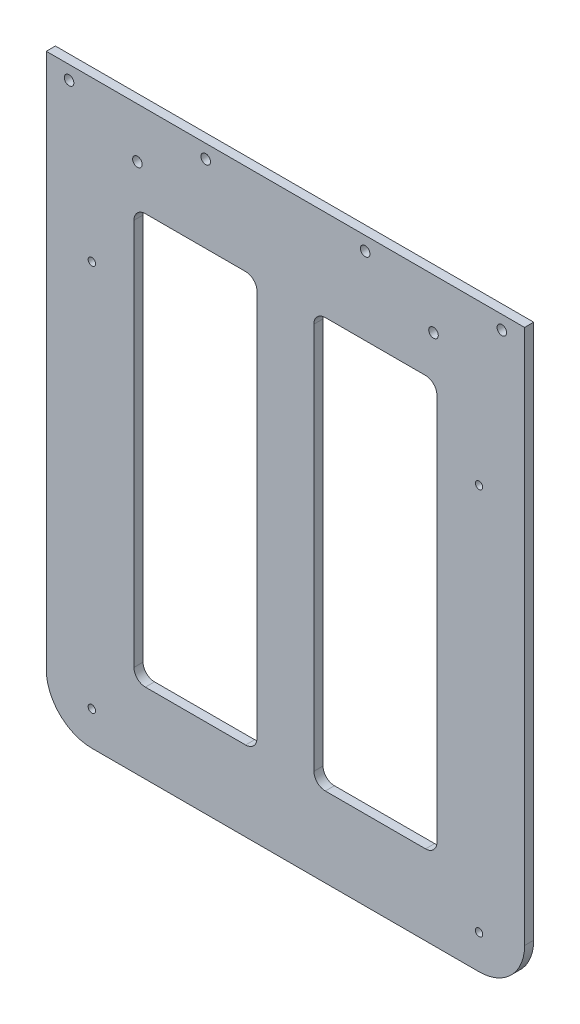
ISO-10303-21;
HEADER;
FILE_DESCRIPTION(('STEP AP214'),'2;1');
FILE_NAME('part.step','',(''),(''),'','','');
FILE_SCHEMA(('AUTOMOTIVE_DESIGN { 1 0 10303 214 1 1 1 1 }'));
ENDSEC;
DATA;
#1=APPLICATION_CONTEXT('core data for automotive mechanical design processes');
#2=APPLICATION_PROTOCOL_DEFINITION('international standard','automotive_design',2000,#1);
#3=PRODUCT_CONTEXT('',#1,'mechanical');
#4=PRODUCT('Part','Part','',(#3));
#5=PRODUCT_RELATED_PRODUCT_CATEGORY('part','',(#4));
#6=PRODUCT_DEFINITION_FORMATION('','',#4);
#7=PRODUCT_DEFINITION_CONTEXT('part definition',#1,'design');
#8=PRODUCT_DEFINITION('design','',#6,#7);
#9=PRODUCT_DEFINITION_SHAPE('','',#8);
#10=(LENGTH_UNIT() NAMED_UNIT(*) SI_UNIT(.MILLI.,.METRE.));
#11=(NAMED_UNIT(*) PLANE_ANGLE_UNIT() SI_UNIT($,.RADIAN.));
#12=(NAMED_UNIT(*) SI_UNIT($,.STERADIAN.) SOLID_ANGLE_UNIT());
#13=UNCERTAINTY_MEASURE_WITH_UNIT(LENGTH_MEASURE(1.E-05),#10,'distance_accuracy_value','');
#14=(GEOMETRIC_REPRESENTATION_CONTEXT(3) GLOBAL_UNCERTAINTY_ASSIGNED_CONTEXT((#13)) GLOBAL_UNIT_ASSIGNED_CONTEXT((#10,
#11,#12)) REPRESENTATION_CONTEXT('',''));
#15=CARTESIAN_POINT('',(0.,0.,0.));
#16=DIRECTION('',(0.,0.,1.));
#17=DIRECTION('',(1.,0.,0.));
#18=AXIS2_PLACEMENT_3D('',#15,#16,#17);
#19=CARTESIAN_POINT('',(0.,0.,0.));
#20=DIRECTION('',(0.,0.,1.));
#21=DIRECTION('',(1.,0.,0.));
#22=AXIS2_PLACEMENT_3D('',#19,#20,#21);
#23=PLANE('',#22);
#24=CARTESIAN_POINT('',(17.5,-87.5,0.));
#25=DIRECTION('',(0.,0.,-1.));
#26=DIRECTION('',(-1.,0.,0.));
#27=AXIS2_PLACEMENT_3D('',#24,#25,#26);
#28=CIRCLE('',#27,5.);
#29=CARTESIAN_POINT('',(12.5,-87.5,0.));
#30=VERTEX_POINT('',#29);
#31=CARTESIAN_POINT('',(17.5,-92.5,0.));
#32=VERTEX_POINT('',#31);
#33=EDGE_CURVE('E292',#30,#32,#28,.F.);
#34=ORIENTED_EDGE('',*,*,#33,.T.);
#35=DIRECTION('',(1.,0.,0.));
#36=VECTOR('',#35,1.);
#37=CARTESIAN_POINT('',(66.5,-92.5,0.));
#38=LINE('',#37,#36);
#39=CARTESIAN_POINT('',(61.5,-92.5,0.));
#40=VERTEX_POINT('',#39);
#41=EDGE_CURVE('E387',#32,#40,#38,.T.);
#42=ORIENTED_EDGE('',*,*,#41,.T.);
#43=CARTESIAN_POINT('',(61.5,-87.5,0.));
#44=DIRECTION('',(0.,0.,-1.));
#45=DIRECTION('',(-1.,0.,0.));
#46=AXIS2_PLACEMENT_3D('',#43,#44,#45);
#47=CIRCLE('',#46,5.);
#48=CARTESIAN_POINT('',(66.5,-87.5,0.));
#49=VERTEX_POINT('',#48);
#50=EDGE_CURVE('E295',#40,#49,#47,.F.);
#51=ORIENTED_EDGE('',*,*,#50,.T.);
#52=DIRECTION('',(0.,1.,0.));
#53=VECTOR('',#52,1.);
#54=CARTESIAN_POINT('',(66.5,87.5,0.));
#55=LINE('',#54,#53);
#56=CARTESIAN_POINT('',(66.5,82.5,0.));
#57=VERTEX_POINT('',#56);
#58=EDGE_CURVE('E391',#49,#57,#55,.T.);
#59=ORIENTED_EDGE('',*,*,#58,.T.);
#60=CARTESIAN_POINT('',(61.5,82.5,0.));
#61=DIRECTION('',(0.,0.,-1.));
#62=DIRECTION('',(-1.,0.,0.));
#63=AXIS2_PLACEMENT_3D('',#60,#61,#62);
#64=CIRCLE('',#63,5.);
#65=CARTESIAN_POINT('',(61.5,87.5,0.));
#66=VERTEX_POINT('',#65);
#67=EDGE_CURVE('E299',#57,#66,#64,.F.);
#68=ORIENTED_EDGE('',*,*,#67,.T.);
#69=DIRECTION('',(1.,0.,0.));
#70=VECTOR('',#69,1.);
#71=CARTESIAN_POINT('',(12.5,87.5,0.));
#72=LINE('',#71,#70);
#73=CARTESIAN_POINT('',(17.5,87.5,0.));
#74=VERTEX_POINT('',#73);
#75=EDGE_CURVE('E393',#66,#74,#72,.F.);
#76=ORIENTED_EDGE('',*,*,#75,.T.);
#77=CARTESIAN_POINT('',(17.5,82.5,0.));
#78=DIRECTION('',(0.,0.,-1.));
#79=DIRECTION('',(-1.,0.,0.));
#80=AXIS2_PLACEMENT_3D('',#77,#78,#79);
#81=CIRCLE('',#80,5.);
#82=CARTESIAN_POINT('',(12.5,82.5,0.));
#83=VERTEX_POINT('',#82);
#84=EDGE_CURVE('E303',#74,#83,#81,.F.);
#85=ORIENTED_EDGE('',*,*,#84,.T.);
#86=DIRECTION('',(0.,-1.,0.));
#87=VECTOR('',#86,1.);
#88=CARTESIAN_POINT('',(12.5,-92.5,0.));
#89=LINE('',#88,#87);
#90=EDGE_CURVE('E306',#83,#30,#89,.T.);
#91=ORIENTED_EDGE('',*,*,#90,.T.);
#92=EDGE_LOOP('',(#34,#42,#51,#59,#68,#76,#85,#91));
#93=FACE_BOUND('',#92,.T.);
#94=CARTESIAN_POINT('',(-61.5,-87.5,0.));
#95=DIRECTION('',(0.,0.,-1.));
#96=DIRECTION('',(-1.,0.,0.));
#97=AXIS2_PLACEMENT_3D('',#94,#95,#96);
#98=CIRCLE('',#97,5.);
#99=CARTESIAN_POINT('',(-66.5,-87.5,0.));
#100=VERTEX_POINT('',#99);
#101=CARTESIAN_POINT('',(-61.5,-92.5,0.));
#102=VERTEX_POINT('',#101);
#103=EDGE_CURVE('E307',#100,#102,#98,.F.);
#104=ORIENTED_EDGE('',*,*,#103,.T.);
#105=DIRECTION('',(1.,0.,0.));
#106=VECTOR('',#105,1.);
#107=CARTESIAN_POINT('',(-12.5,-92.5,0.));
#108=LINE('',#107,#106);
#109=CARTESIAN_POINT('',(-17.5,-92.5,0.));
#110=VERTEX_POINT('',#109);
#111=EDGE_CURVE('E395',#102,#110,#108,.T.);
#112=ORIENTED_EDGE('',*,*,#111,.T.);
#113=CARTESIAN_POINT('',(-17.5,-87.5,0.));
#114=DIRECTION('',(0.,0.,-1.));
#115=DIRECTION('',(-1.,0.,0.));
#116=AXIS2_PLACEMENT_3D('',#113,#114,#115);
#117=CIRCLE('',#116,5.);
#118=CARTESIAN_POINT('',(-12.5,-87.5,0.));
#119=VERTEX_POINT('',#118);
#120=EDGE_CURVE('E311',#110,#119,#117,.F.);
#121=ORIENTED_EDGE('',*,*,#120,.T.);
#122=DIRECTION('',(0.,1.,0.));
#123=VECTOR('',#122,1.);
#124=CARTESIAN_POINT('',(-12.5,87.5,0.));
#125=LINE('',#124,#123);
#126=CARTESIAN_POINT('',(-12.5,82.5,0.));
#127=VERTEX_POINT('',#126);
#128=EDGE_CURVE('E398',#119,#127,#125,.T.);
#129=ORIENTED_EDGE('',*,*,#128,.T.);
#130=CARTESIAN_POINT('',(-17.5,82.5,0.));
#131=DIRECTION('',(0.,0.,-1.));
#132=DIRECTION('',(-1.,0.,0.));
#133=AXIS2_PLACEMENT_3D('',#130,#131,#132);
#134=CIRCLE('',#133,5.);
#135=CARTESIAN_POINT('',(-17.5,87.5,0.));
#136=VERTEX_POINT('',#135);
#137=EDGE_CURVE('E315',#127,#136,#134,.F.);
#138=ORIENTED_EDGE('',*,*,#137,.T.);
#139=DIRECTION('',(1.,0.,0.));
#140=VECTOR('',#139,1.);
#141=CARTESIAN_POINT('',(-66.5,87.5,0.));
#142=LINE('',#141,#140);
#143=CARTESIAN_POINT('',(-61.5,87.5,0.));
#144=VERTEX_POINT('',#143);
#145=EDGE_CURVE('E190',#136,#144,#142,.F.);
#146=ORIENTED_EDGE('',*,*,#145,.T.);
#147=CARTESIAN_POINT('',(-61.5,82.5,0.));
#148=DIRECTION('',(0.,0.,-1.));
#149=DIRECTION('',(-1.,0.,0.));
#150=AXIS2_PLACEMENT_3D('',#147,#148,#149);
#151=CIRCLE('',#150,5.);
#152=CARTESIAN_POINT('',(-66.5,82.5,0.));
#153=VERTEX_POINT('',#152);
#154=EDGE_CURVE('E319',#144,#153,#151,.F.);
#155=ORIENTED_EDGE('',*,*,#154,.T.);
#156=DIRECTION('',(0.,-1.,0.));
#157=VECTOR('',#156,1.);
#158=CARTESIAN_POINT('',(-66.5,-92.5,0.));
#159=LINE('',#158,#157);
#160=EDGE_CURVE('E322',#153,#100,#159,.T.);
#161=ORIENTED_EDGE('',*,*,#160,.T.);
#162=EDGE_LOOP('',(#104,#112,#121,#129,#138,#146,#155,#161));
#163=FACE_BOUND('',#162,.T.);
#164=CARTESIAN_POINT('',(95.,121.5,0.));
#165=DIRECTION('',(0.,0.,1.));
#166=DIRECTION('',(1.,0.,0.));
#167=AXIS2_PLACEMENT_3D('',#164,#165,#166);
#168=CIRCLE('',#167,2.1);
#169=CARTESIAN_POINT('',(97.1,121.5,0.));
#170=VERTEX_POINT('',#169);
#171=EDGE_CURVE('E323',#170,#170,#168,.T.);
#172=ORIENTED_EDGE('',*,*,#171,.T.);
#173=EDGE_LOOP('',(#172));
#174=FACE_BOUND('',#173,.T.);
#175=CARTESIAN_POINT('',(35.,121.5,0.));
#176=DIRECTION('',(0.,0.,1.));
#177=DIRECTION('',(1.,0.,0.));
#178=AXIS2_PLACEMENT_3D('',#175,#176,#177);
#179=CIRCLE('',#178,2.1);
#180=CARTESIAN_POINT('',(37.1,121.5,0.));
#181=VERTEX_POINT('',#180);
#182=EDGE_CURVE('E326',#181,#181,#179,.T.);
#183=ORIENTED_EDGE('',*,*,#182,.T.);
#184=EDGE_LOOP('',(#183));
#185=FACE_BOUND('',#184,.T.);
#186=CARTESIAN_POINT('',(-95.,121.5,0.));
#187=DIRECTION('',(0.,0.,1.));
#188=DIRECTION('',(1.,0.,0.));
#189=AXIS2_PLACEMENT_3D('',#186,#187,#188);
#190=CIRCLE('',#189,2.1);
#191=CARTESIAN_POINT('',(-92.9,121.5,0.));
#192=VERTEX_POINT('',#191);
#193=EDGE_CURVE('E331',#192,#192,#190,.T.);
#194=ORIENTED_EDGE('',*,*,#193,.T.);
#195=EDGE_LOOP('',(#194));
#196=FACE_BOUND('',#195,.T.);
#197=CARTESIAN_POINT('',(-65.,105.5,0.));
#198=DIRECTION('',(0.,0.,1.));
#199=DIRECTION('',(1.,0.,0.));
#200=AXIS2_PLACEMENT_3D('',#197,#198,#199);
#201=CIRCLE('',#200,2.1);
#202=CARTESIAN_POINT('',(-62.9,105.5,0.));
#203=VERTEX_POINT('',#202);
#204=EDGE_CURVE('E336',#203,#203,#201,.T.);
#205=ORIENTED_EDGE('',*,*,#204,.T.);
#206=EDGE_LOOP('',(#205));
#207=FACE_BOUND('',#206,.T.);
#208=CARTESIAN_POINT('',(-35.,121.5,0.));
#209=DIRECTION('',(0.,0.,1.));
#210=DIRECTION('',(1.,0.,0.));
#211=AXIS2_PLACEMENT_3D('',#208,#209,#210);
#212=CIRCLE('',#211,2.1);
#213=CARTESIAN_POINT('',(-32.9,121.5,0.));
#214=VERTEX_POINT('',#213);
#215=EDGE_CURVE('E341',#214,#214,#212,.T.);
#216=ORIENTED_EDGE('',*,*,#215,.T.);
#217=EDGE_LOOP('',(#216));
#218=FACE_BOUND('',#217,.T.);
#219=CARTESIAN_POINT('',(65.,105.5,0.));
#220=DIRECTION('',(0.,0.,1.));
#221=DIRECTION('',(1.,0.,0.));
#222=AXIS2_PLACEMENT_3D('',#219,#220,#221);
#223=CIRCLE('',#222,2.1);
#224=CARTESIAN_POINT('',(67.1,105.5,0.));
#225=VERTEX_POINT('',#224);
#226=EDGE_CURVE('E346',#225,#225,#223,.T.);
#227=ORIENTED_EDGE('',*,*,#226,.T.);
#228=EDGE_LOOP('',(#227));
#229=FACE_BOUND('',#228,.T.);
#230=CARTESIAN_POINT('',(85.,-112.5,0.));
#231=DIRECTION('',(0.,0.,1.));
#232=DIRECTION('',(1.,0.,0.));
#233=AXIS2_PLACEMENT_3D('',#230,#231,#232);
#234=CIRCLE('',#233,1.621);
#235=CARTESIAN_POINT('',(86.621,-112.5,0.));
#236=VERTEX_POINT('',#235);
#237=EDGE_CURVE('E351',#236,#236,#234,.T.);
#238=ORIENTED_EDGE('',*,*,#237,.T.);
#239=EDGE_LOOP('',(#238));
#240=FACE_BOUND('',#239,.T.);
#241=CARTESIAN_POINT('',(-85.,57.5,0.));
#242=DIRECTION('',(0.,0.,1.));
#243=DIRECTION('',(1.,0.,0.));
#244=AXIS2_PLACEMENT_3D('',#241,#242,#243);
#245=CIRCLE('',#244,1.621);
#246=CARTESIAN_POINT('',(-83.379,57.5,0.));
#247=VERTEX_POINT('',#246);
#248=EDGE_CURVE('E356',#247,#247,#245,.T.);
#249=ORIENTED_EDGE('',*,*,#248,.T.);
#250=EDGE_LOOP('',(#249));
#251=FACE_BOUND('',#250,.T.);
#252=CARTESIAN_POINT('',(-85.,-112.5,0.));
#253=DIRECTION('',(0.,0.,1.));
#254=DIRECTION('',(1.,0.,0.));
#255=AXIS2_PLACEMENT_3D('',#252,#253,#254);
#256=CIRCLE('',#255,1.621);
#257=CARTESIAN_POINT('',(-83.379,-112.5,0.));
#258=VERTEX_POINT('',#257);
#259=EDGE_CURVE('E185',#258,#258,#256,.T.);
#260=ORIENTED_EDGE('',*,*,#259,.T.);
#261=EDGE_LOOP('',(#260));
#262=FACE_BOUND('',#261,.T.);
#263=CARTESIAN_POINT('',(85.,57.5,0.));
#264=DIRECTION('',(0.,0.,1.));
#265=DIRECTION('',(1.,0.,0.));
#266=AXIS2_PLACEMENT_3D('',#263,#264,#265);
#267=CIRCLE('',#266,1.621);
#268=CARTESIAN_POINT('',(86.621,57.5,0.));
#269=VERTEX_POINT('',#268);
#270=EDGE_CURVE('E182',#269,#269,#267,.T.);
#271=ORIENTED_EDGE('',*,*,#270,.T.);
#272=EDGE_LOOP('',(#271));
#273=FACE_BOUND('',#272,.T.);
#274=DIRECTION('',(1.,0.,0.));
#275=VECTOR('',#274,1.);
#276=CARTESIAN_POINT('',(-105.,-127.5,0.));
#277=LINE('',#276,#275);
#278=CARTESIAN_POINT('',(-85.,-127.5,0.));
#279=VERTEX_POINT('',#278);
#280=CARTESIAN_POINT('',(85.,-127.5,0.));
#281=VERTEX_POINT('',#280);
#282=EDGE_CURVE('E162',#279,#281,#277,.T.);
#283=ORIENTED_EDGE('',*,*,#282,.F.);
#284=CARTESIAN_POINT('',(-85.,-107.5,0.));
#285=DIRECTION('',(0.,0.,1.));
#286=DIRECTION('',(1.,0.,0.));
#287=AXIS2_PLACEMENT_3D('',#284,#285,#286);
#288=CIRCLE('',#287,20.);
#289=CARTESIAN_POINT('',(-105.,-107.5,0.));
#290=VERTEX_POINT('',#289);
#291=EDGE_CURVE('E179',#290,#279,#288,.T.);
#292=ORIENTED_EDGE('',*,*,#291,.F.);
#293=DIRECTION('',(0.,1.,0.));
#294=VECTOR('',#293,1.);
#295=CARTESIAN_POINT('',(-105.,127.5,0.));
#296=LINE('',#295,#294);
#297=CARTESIAN_POINT('',(-105.,127.5,0.));
#298=VERTEX_POINT('',#297);
#299=EDGE_CURVE('E192',#298,#290,#296,.F.);
#300=ORIENTED_EDGE('',*,*,#299,.F.);
#301=DIRECTION('',(1.,0.,0.));
#302=VECTOR('',#301,1.);
#303=CARTESIAN_POINT('',(105.,127.5,0.));
#304=LINE('',#303,#302);
#305=CARTESIAN_POINT('',(105.,127.5,0.));
#306=VERTEX_POINT('',#305);
#307=EDGE_CURVE('E198',#306,#298,#304,.F.);
#308=ORIENTED_EDGE('',*,*,#307,.F.);
#309=DIRECTION('',(0.,1.,0.));
#310=VECTOR('',#309,1.);
#311=CARTESIAN_POINT('',(105.,-127.5,0.));
#312=LINE('',#311,#310);
#313=CARTESIAN_POINT('',(105.,-107.5,0.));
#314=VERTEX_POINT('',#313);
#315=EDGE_CURVE('E166',#314,#306,#312,.T.);
#316=ORIENTED_EDGE('',*,*,#315,.F.);
#317=CARTESIAN_POINT('',(85.,-107.5,0.));
#318=DIRECTION('',(0.,0.,1.));
#319=DIRECTION('',(1.,0.,0.));
#320=AXIS2_PLACEMENT_3D('',#317,#318,#319);
#321=CIRCLE('',#320,20.);
#322=EDGE_CURVE('E20',#281,#314,#321,.T.);
#323=ORIENTED_EDGE('',*,*,#322,.F.);
#324=EDGE_LOOP('',(#283,#292,#300,#308,#316,#323));
#325=FACE_BOUND('',#324,.T.);
#326=ADVANCED_FACE('F17',(#93,#163,#174,#185,#196,#207,#218,#229,#240,#251,#262,#273,#325),#23,.F.);
#327=CARTESIAN_POINT('',(85.,-107.5,0.));
#328=DIRECTION('',(0.,0.,1.));
#329=DIRECTION('',(1.,0.,0.));
#330=AXIS2_PLACEMENT_3D('',#327,#328,#329);
#331=CYLINDRICAL_SURFACE('',#330,20.);
#332=ORIENTED_EDGE('',*,*,#322,.T.);
#333=DIRECTION('',(0.,0.,-1.));
#334=VECTOR('',#333,1.);
#335=CARTESIAN_POINT('',(105.,-107.5,0.));
#336=LINE('',#335,#334);
#337=CARTESIAN_POINT('',(105.,-107.5,4.));
#338=VERTEX_POINT('',#337);
#339=EDGE_CURVE('E169',#338,#314,#336,.T.);
#340=ORIENTED_EDGE('',*,*,#339,.F.);
#341=CARTESIAN_POINT('',(85.,-107.5,4.));
#342=DIRECTION('',(0.,0.,1.));
#343=DIRECTION('',(1.,0.,0.));
#344=AXIS2_PLACEMENT_3D('',#341,#342,#343);
#345=CIRCLE('',#344,20.);
#346=CARTESIAN_POINT('',(85.,-127.5,4.));
#347=VERTEX_POINT('',#346);
#348=EDGE_CURVE('E174',#347,#338,#345,.T.);
#349=ORIENTED_EDGE('',*,*,#348,.F.);
#350=DIRECTION('',(0.,0.,-1.));
#351=VECTOR('',#350,1.);
#352=CARTESIAN_POINT('',(85.,-127.5,0.));
#353=LINE('',#352,#351);
#354=EDGE_CURVE('E171',#281,#347,#353,.F.);
#355=ORIENTED_EDGE('',*,*,#354,.F.);
#356=EDGE_LOOP('',(#332,#340,#349,#355));
#357=FACE_BOUND('',#356,.T.);
#358=ADVANCED_FACE('F172',(#357),#331,.T.);
#359=CARTESIAN_POINT('',(105.,-127.5,0.));
#360=DIRECTION('',(1.,0.,0.));
#361=DIRECTION('',(0.,0.,-1.));
#362=AXIS2_PLACEMENT_3D('',#359,#360,#361);
#363=PLANE('',#362);
#364=DIRECTION('',(0.,0.,1.));
#365=VECTOR('',#364,1.);
#366=CARTESIAN_POINT('',(105.,127.5,0.));
#367=LINE('',#366,#365);
#368=CARTESIAN_POINT('',(105.,127.5,4.));
#369=VERTEX_POINT('',#368);
#370=EDGE_CURVE('E201',#369,#306,#367,.F.);
#371=ORIENTED_EDGE('',*,*,#370,.F.);
#372=DIRECTION('',(0.,1.,0.));
#373=VECTOR('',#372,1.);
#374=CARTESIAN_POINT('',(105.,0.,4.));
#375=LINE('',#374,#373);
#376=EDGE_CURVE('E291',#338,#369,#375,.T.);
#377=ORIENTED_EDGE('',*,*,#376,.F.);
#378=ORIENTED_EDGE('',*,*,#339,.T.);
#379=ORIENTED_EDGE('',*,*,#315,.T.);
#380=EDGE_LOOP('',(#371,#377,#378,#379));
#381=FACE_BOUND('',#380,.T.);
#382=ADVANCED_FACE('F609',(#381),#363,.T.);
#383=CARTESIAN_POINT('',(105.,127.5,0.));
#384=DIRECTION('',(0.,1.,0.));
#385=DIRECTION('',(0.,0.,1.));
#386=AXIS2_PLACEMENT_3D('',#383,#384,#385);
#387=PLANE('',#386);
#388=DIRECTION('',(1.,0.,0.));
#389=VECTOR('',#388,1.);
#390=CARTESIAN_POINT('',(0.,127.5,4.));
#391=LINE('',#390,#389);
#392=CARTESIAN_POINT('',(-105.,127.5,4.));
#393=VERTEX_POINT('',#392);
#394=EDGE_CURVE('E377',#369,#393,#391,.F.);
#395=ORIENTED_EDGE('',*,*,#394,.F.);
#396=ORIENTED_EDGE('',*,*,#370,.T.);
#397=ORIENTED_EDGE('',*,*,#307,.T.);
#398=DIRECTION('',(0.,0.,1.));
#399=VECTOR('',#398,1.);
#400=CARTESIAN_POINT('',(-105.,127.5,0.));
#401=LINE('',#400,#399);
#402=EDGE_CURVE('E195',#393,#298,#401,.F.);
#403=ORIENTED_EDGE('',*,*,#402,.F.);
#404=EDGE_LOOP('',(#395,#396,#397,#403));
#405=FACE_BOUND('',#404,.T.);
#406=ADVANCED_FACE('F605',(#405),#387,.T.);
#407=CARTESIAN_POINT('',(-105.,127.5,0.));
#408=DIRECTION('',(-1.,0.,0.));
#409=DIRECTION('',(0.,0.,1.));
#410=AXIS2_PLACEMENT_3D('',#407,#408,#409);
#411=PLANE('',#410);
#412=ORIENTED_EDGE('',*,*,#402,.T.);
#413=ORIENTED_EDGE('',*,*,#299,.T.);
#414=DIRECTION('',(0.,0.,1.));
#415=VECTOR('',#414,1.);
#416=CARTESIAN_POINT('',(-105.,-107.5,0.));
#417=LINE('',#416,#415);
#418=CARTESIAN_POINT('',(-105.,-107.5,4.));
#419=VERTEX_POINT('',#418);
#420=EDGE_CURVE('E194',#419,#290,#417,.F.);
#421=ORIENTED_EDGE('',*,*,#420,.F.);
#422=DIRECTION('',(0.,1.,0.));
#423=VECTOR('',#422,1.);
#424=CARTESIAN_POINT('',(-105.,0.,4.));
#425=LINE('',#424,#423);
#426=EDGE_CURVE('E289',#393,#419,#425,.F.);
#427=ORIENTED_EDGE('',*,*,#426,.F.);
#428=EDGE_LOOP('',(#412,#413,#421,#427));
#429=FACE_BOUND('',#428,.T.);
#430=ADVANCED_FACE('F602',(#429),#411,.T.);
#431=CARTESIAN_POINT('',(-85.,-107.5,0.));
#432=DIRECTION('',(0.,0.,1.));
#433=DIRECTION('',(1.,0.,0.));
#434=AXIS2_PLACEMENT_3D('',#431,#432,#433);
#435=CYLINDRICAL_SURFACE('',#434,20.);
#436=ORIENTED_EDGE('',*,*,#291,.T.);
#437=DIRECTION('',(0.,0.,-1.));
#438=VECTOR('',#437,1.);
#439=CARTESIAN_POINT('',(-85.,-127.5,0.));
#440=LINE('',#439,#438);
#441=CARTESIAN_POINT('',(-85.,-127.5,4.));
#442=VERTEX_POINT('',#441);
#443=EDGE_CURVE('E178',#442,#279,#440,.T.);
#444=ORIENTED_EDGE('',*,*,#443,.F.);
#445=CARTESIAN_POINT('',(-85.,-107.5,4.));
#446=DIRECTION('',(0.,0.,1.));
#447=DIRECTION('',(1.,0.,0.));
#448=AXIS2_PLACEMENT_3D('',#445,#446,#447);
#449=CIRCLE('',#448,20.);
#450=EDGE_CURVE('E286',#419,#442,#449,.T.);
#451=ORIENTED_EDGE('',*,*,#450,.F.);
#452=ORIENTED_EDGE('',*,*,#420,.T.);
#453=EDGE_LOOP('',(#436,#444,#451,#452));
#454=FACE_BOUND('',#453,.T.);
#455=ADVANCED_FACE('F599',(#454),#435,.T.);
#456=CARTESIAN_POINT('',(-105.,-127.5,0.));
#457=DIRECTION('',(0.,-1.,0.));
#458=DIRECTION('',(0.,0.,-1.));
#459=AXIS2_PLACEMENT_3D('',#456,#457,#458);
#460=PLANE('',#459);
#461=ORIENTED_EDGE('',*,*,#443,.T.);
#462=ORIENTED_EDGE('',*,*,#282,.T.);
#463=ORIENTED_EDGE('',*,*,#354,.T.);
#464=DIRECTION('',(1.,0.,0.));
#465=VECTOR('',#464,1.);
#466=CARTESIAN_POINT('',(0.,-127.5,4.));
#467=LINE('',#466,#465);
#468=EDGE_CURVE('E283',#442,#347,#467,.T.);
#469=ORIENTED_EDGE('',*,*,#468,.F.);
#470=EDGE_LOOP('',(#461,#462,#463,#469));
#471=FACE_BOUND('',#470,.T.);
#472=ADVANCED_FACE('F181',(#471),#460,.T.);
#473=CARTESIAN_POINT('',(85.,57.5,-1.9));
#474=DIRECTION('',(0.,0.,1.));
#475=DIRECTION('',(1.,0.,0.));
#476=AXIS2_PLACEMENT_3D('',#473,#474,#475);
#477=CYLINDRICAL_SURFACE('',#476,1.621);
#478=CARTESIAN_POINT('',(85.,57.5,4.));
#479=DIRECTION('',(0.,0.,1.));
#480=DIRECTION('',(1.,0.,0.));
#481=AXIS2_PLACEMENT_3D('',#478,#479,#480);
#482=CIRCLE('',#481,1.621);
#483=CARTESIAN_POINT('',(86.621,57.5,4.));
#484=VERTEX_POINT('',#483);
#485=EDGE_CURVE('E278',#484,#484,#482,.F.);
#486=ORIENTED_EDGE('',*,*,#485,.F.);
#487=EDGE_LOOP('',(#486));
#488=FACE_BOUND('',#487,.T.);
#489=ORIENTED_EDGE('',*,*,#270,.F.);
#490=EDGE_LOOP('',(#489));
#491=FACE_BOUND('',#490,.T.);
#492=ADVANCED_FACE('F592',(#488,#491),#477,.F.);
#493=CARTESIAN_POINT('',(-85.,-112.5,-1.9));
#494=DIRECTION('',(0.,0.,1.));
#495=DIRECTION('',(1.,0.,0.));
#496=AXIS2_PLACEMENT_3D('',#493,#494,#495);
#497=CYLINDRICAL_SURFACE('',#496,1.621);
#498=CARTESIAN_POINT('',(-85.,-112.5,4.));
#499=DIRECTION('',(0.,0.,1.));
#500=DIRECTION('',(1.,0.,0.));
#501=AXIS2_PLACEMENT_3D('',#498,#499,#500);
#502=CIRCLE('',#501,1.621);
#503=CARTESIAN_POINT('',(-83.379,-112.5,4.));
#504=VERTEX_POINT('',#503);
#505=EDGE_CURVE('E273',#504,#504,#502,.F.);
#506=ORIENTED_EDGE('',*,*,#505,.F.);
#507=EDGE_LOOP('',(#506));
#508=FACE_BOUND('',#507,.T.);
#509=ORIENTED_EDGE('',*,*,#259,.F.);
#510=EDGE_LOOP('',(#509));
#511=FACE_BOUND('',#510,.T.);
#512=ADVANCED_FACE('F588',(#508,#511),#497,.F.);
#513=CARTESIAN_POINT('',(-85.,57.5,-1.9));
#514=DIRECTION('',(0.,0.,1.));
#515=DIRECTION('',(1.,0.,0.));
#516=AXIS2_PLACEMENT_3D('',#513,#514,#515);
#517=CYLINDRICAL_SURFACE('',#516,1.621);
#518=CARTESIAN_POINT('',(-85.,57.5,4.));
#519=DIRECTION('',(0.,0.,1.));
#520=DIRECTION('',(1.,0.,0.));
#521=AXIS2_PLACEMENT_3D('',#518,#519,#520);
#522=CIRCLE('',#521,1.621);
#523=CARTESIAN_POINT('',(-83.379,57.5,4.));
#524=VERTEX_POINT('',#523);
#525=EDGE_CURVE('E268',#524,#524,#522,.F.);
#526=ORIENTED_EDGE('',*,*,#525,.F.);
#527=EDGE_LOOP('',(#526));
#528=FACE_BOUND('',#527,.T.);
#529=ORIENTED_EDGE('',*,*,#248,.F.);
#530=EDGE_LOOP('',(#529));
#531=FACE_BOUND('',#530,.T.);
#532=ADVANCED_FACE('F584',(#528,#531),#517,.F.);
#533=CARTESIAN_POINT('',(85.,-112.5,-1.9));
#534=DIRECTION('',(0.,0.,1.));
#535=DIRECTION('',(1.,0.,0.));
#536=AXIS2_PLACEMENT_3D('',#533,#534,#535);
#537=CYLINDRICAL_SURFACE('',#536,1.621);
#538=CARTESIAN_POINT('',(85.,-112.5,4.));
#539=DIRECTION('',(0.,0.,1.));
#540=DIRECTION('',(1.,0.,0.));
#541=AXIS2_PLACEMENT_3D('',#538,#539,#540);
#542=CIRCLE('',#541,1.621);
#543=CARTESIAN_POINT('',(86.621,-112.5,4.));
#544=VERTEX_POINT('',#543);
#545=EDGE_CURVE('E263',#544,#544,#542,.F.);
#546=ORIENTED_EDGE('',*,*,#545,.F.);
#547=EDGE_LOOP('',(#546));
#548=FACE_BOUND('',#547,.T.);
#549=ORIENTED_EDGE('',*,*,#237,.F.);
#550=EDGE_LOOP('',(#549));
#551=FACE_BOUND('',#550,.T.);
#552=ADVANCED_FACE('F580',(#548,#551),#537,.F.);
#553=CARTESIAN_POINT('',(65.,105.5,0.));
#554=DIRECTION('',(0.,0.,1.));
#555=DIRECTION('',(1.,0.,0.));
#556=AXIS2_PLACEMENT_3D('',#553,#554,#555);
#557=CYLINDRICAL_SURFACE('',#556,2.1);
#558=CARTESIAN_POINT('',(65.,105.5,4.));
#559=DIRECTION('',(0.,0.,1.));
#560=DIRECTION('',(1.,0.,0.));
#561=AXIS2_PLACEMENT_3D('',#558,#559,#560);
#562=CIRCLE('',#561,2.1);
#563=CARTESIAN_POINT('',(67.1,105.5,4.));
#564=VERTEX_POINT('',#563);
#565=EDGE_CURVE('E258',#564,#564,#562,.F.);
#566=ORIENTED_EDGE('',*,*,#565,.F.);
#567=EDGE_LOOP('',(#566));
#568=FACE_BOUND('',#567,.T.);
#569=ORIENTED_EDGE('',*,*,#226,.F.);
#570=EDGE_LOOP('',(#569));
#571=FACE_BOUND('',#570,.T.);
#572=ADVANCED_FACE('F576',(#568,#571),#557,.F.);
#573=CARTESIAN_POINT('',(-35.,121.5,0.));
#574=DIRECTION('',(0.,0.,1.));
#575=DIRECTION('',(1.,0.,0.));
#576=AXIS2_PLACEMENT_3D('',#573,#574,#575);
#577=CYLINDRICAL_SURFACE('',#576,2.1);
#578=CARTESIAN_POINT('',(-35.,121.5,4.));
#579=DIRECTION('',(0.,0.,1.));
#580=DIRECTION('',(1.,0.,0.));
#581=AXIS2_PLACEMENT_3D('',#578,#579,#580);
#582=CIRCLE('',#581,2.1);
#583=CARTESIAN_POINT('',(-32.9,121.5,4.));
#584=VERTEX_POINT('',#583);
#585=EDGE_CURVE('E253',#584,#584,#582,.F.);
#586=ORIENTED_EDGE('',*,*,#585,.F.);
#587=EDGE_LOOP('',(#586));
#588=FACE_BOUND('',#587,.T.);
#589=ORIENTED_EDGE('',*,*,#215,.F.);
#590=EDGE_LOOP('',(#589));
#591=FACE_BOUND('',#590,.T.);
#592=ADVANCED_FACE('F572',(#588,#591),#577,.F.);
#593=CARTESIAN_POINT('',(-65.,105.5,0.));
#594=DIRECTION('',(0.,0.,1.));
#595=DIRECTION('',(1.,0.,0.));
#596=AXIS2_PLACEMENT_3D('',#593,#594,#595);
#597=CYLINDRICAL_SURFACE('',#596,2.1);
#598=CARTESIAN_POINT('',(-65.,105.5,4.));
#599=DIRECTION('',(0.,0.,1.));
#600=DIRECTION('',(1.,0.,0.));
#601=AXIS2_PLACEMENT_3D('',#598,#599,#600);
#602=CIRCLE('',#601,2.1);
#603=CARTESIAN_POINT('',(-62.9,105.5,4.));
#604=VERTEX_POINT('',#603);
#605=EDGE_CURVE('E248',#604,#604,#602,.F.);
#606=ORIENTED_EDGE('',*,*,#605,.F.);
#607=EDGE_LOOP('',(#606));
#608=FACE_BOUND('',#607,.T.);
#609=ORIENTED_EDGE('',*,*,#204,.F.);
#610=EDGE_LOOP('',(#609));
#611=FACE_BOUND('',#610,.T.);
#612=ADVANCED_FACE('F568',(#608,#611),#597,.F.);
#613=CARTESIAN_POINT('',(-95.,121.5,0.));
#614=DIRECTION('',(0.,0.,1.));
#615=DIRECTION('',(1.,0.,0.));
#616=AXIS2_PLACEMENT_3D('',#613,#614,#615);
#617=CYLINDRICAL_SURFACE('',#616,2.1);
#618=CARTESIAN_POINT('',(-95.,121.5,4.));
#619=DIRECTION('',(0.,0.,1.));
#620=DIRECTION('',(1.,0.,0.));
#621=AXIS2_PLACEMENT_3D('',#618,#619,#620);
#622=CIRCLE('',#621,2.1);
#623=CARTESIAN_POINT('',(-92.9,121.5,4.));
#624=VERTEX_POINT('',#623);
#625=EDGE_CURVE('E243',#624,#624,#622,.F.);
#626=ORIENTED_EDGE('',*,*,#625,.F.);
#627=EDGE_LOOP('',(#626));
#628=FACE_BOUND('',#627,.T.);
#629=ORIENTED_EDGE('',*,*,#193,.F.);
#630=EDGE_LOOP('',(#629));
#631=FACE_BOUND('',#630,.T.);
#632=ADVANCED_FACE('F564',(#628,#631),#617,.F.);
#633=CARTESIAN_POINT('',(35.,121.5,0.));
#634=DIRECTION('',(0.,0.,1.));
#635=DIRECTION('',(1.,0.,0.));
#636=AXIS2_PLACEMENT_3D('',#633,#634,#635);
#637=CYLINDRICAL_SURFACE('',#636,2.1);
#638=CARTESIAN_POINT('',(35.,121.5,4.));
#639=DIRECTION('',(0.,0.,1.));
#640=DIRECTION('',(1.,0.,0.));
#641=AXIS2_PLACEMENT_3D('',#638,#639,#640);
#642=CIRCLE('',#641,2.1);
#643=CARTESIAN_POINT('',(37.1,121.5,4.));
#644=VERTEX_POINT('',#643);
#645=EDGE_CURVE('E238',#644,#644,#642,.F.);
#646=ORIENTED_EDGE('',*,*,#645,.F.);
#647=EDGE_LOOP('',(#646));
#648=FACE_BOUND('',#647,.T.);
#649=ORIENTED_EDGE('',*,*,#182,.F.);
#650=EDGE_LOOP('',(#649));
#651=FACE_BOUND('',#650,.T.);
#652=ADVANCED_FACE('F560',(#648,#651),#637,.F.);
#653=CARTESIAN_POINT('',(95.,121.5,0.));
#654=DIRECTION('',(0.,0.,1.));
#655=DIRECTION('',(1.,0.,0.));
#656=AXIS2_PLACEMENT_3D('',#653,#654,#655);
#657=CYLINDRICAL_SURFACE('',#656,2.1);
#658=CARTESIAN_POINT('',(95.,121.5,4.));
#659=DIRECTION('',(0.,0.,1.));
#660=DIRECTION('',(1.,0.,0.));
#661=AXIS2_PLACEMENT_3D('',#658,#659,#660);
#662=CIRCLE('',#661,2.1);
#663=CARTESIAN_POINT('',(97.1,121.5,4.));
#664=VERTEX_POINT('',#663);
#665=EDGE_CURVE('E235',#664,#664,#662,.F.);
#666=ORIENTED_EDGE('',*,*,#665,.F.);
#667=EDGE_LOOP('',(#666));
#668=FACE_BOUND('',#667,.T.);
#669=ORIENTED_EDGE('',*,*,#171,.F.);
#670=EDGE_LOOP('',(#669));
#671=FACE_BOUND('',#670,.T.);
#672=ADVANCED_FACE('F557',(#668,#671),#657,.F.);
#673=CARTESIAN_POINT('',(-66.5,-92.5,4.));
#674=DIRECTION('',(-1.,0.,0.));
#675=DIRECTION('',(0.,-1.,0.));
#676=AXIS2_PLACEMENT_3D('',#673,#674,#675);
#677=PLANE('',#676);
#678=ORIENTED_EDGE('',*,*,#160,.F.);
#679=DIRECTION('',(0.,0.,-1.));
#680=VECTOR('',#679,1.);
#681=CARTESIAN_POINT('',(-66.5,82.5,4.));
#682=LINE('',#681,#680);
#683=CARTESIAN_POINT('',(-66.5,82.5,4.));
#684=VERTEX_POINT('',#683);
#685=EDGE_CURVE('E321',#153,#684,#682,.F.);
#686=ORIENTED_EDGE('',*,*,#685,.T.);
#687=DIRECTION('',(0.,1.,0.));
#688=VECTOR('',#687,1.);
#689=CARTESIAN_POINT('',(-66.5,0.,4.));
#690=LINE('',#689,#688);
#691=CARTESIAN_POINT('',(-66.5,-87.5,4.));
#692=VERTEX_POINT('',#691);
#693=EDGE_CURVE('E234',#692,#684,#690,.T.);
#694=ORIENTED_EDGE('',*,*,#693,.F.);
#695=DIRECTION('',(0.,0.,-1.));
#696=VECTOR('',#695,1.);
#697=CARTESIAN_POINT('',(-66.5,-87.5,4.));
#698=LINE('',#697,#696);
#699=EDGE_CURVE('E310',#692,#100,#698,.T.);
#700=ORIENTED_EDGE('',*,*,#699,.T.);
#701=EDGE_LOOP('',(#678,#686,#694,#700));
#702=FACE_BOUND('',#701,.T.);
#703=ADVANCED_FACE('F554',(#702),#677,.F.);
#704=CARTESIAN_POINT('',(-61.5,82.5,4.));
#705=DIRECTION('',(0.,0.,-1.));
#706=DIRECTION('',(-1.,0.,0.));
#707=AXIS2_PLACEMENT_3D('',#704,#705,#706);
#708=CYLINDRICAL_SURFACE('',#707,5.);
#709=ORIENTED_EDGE('',*,*,#685,.F.);
#710=ORIENTED_EDGE('',*,*,#154,.F.);
#711=DIRECTION('',(0.,0.,1.));
#712=VECTOR('',#711,1.);
#713=CARTESIAN_POINT('',(-61.5,87.5,4.));
#714=LINE('',#713,#712);
#715=CARTESIAN_POINT('',(-61.5,87.5,4.));
#716=VERTEX_POINT('',#715);
#717=EDGE_CURVE('E318',#144,#716,#714,.T.);
#718=ORIENTED_EDGE('',*,*,#717,.T.);
#719=CARTESIAN_POINT('',(-61.5,82.5,4.));
#720=DIRECTION('',(0.,0.,-1.));
#721=DIRECTION('',(-1.,0.,0.));
#722=AXIS2_PLACEMENT_3D('',#719,#720,#721);
#723=CIRCLE('',#722,5.);
#724=EDGE_CURVE('E231',#684,#716,#723,.T.);
#725=ORIENTED_EDGE('',*,*,#724,.F.);
#726=EDGE_LOOP('',(#709,#710,#718,#725));
#727=FACE_BOUND('',#726,.T.);
#728=ADVANCED_FACE('F420',(#727),#708,.F.);
#729=CARTESIAN_POINT('',(-66.5,87.5,4.));
#730=DIRECTION('',(0.,1.,0.));
#731=DIRECTION('',(0.,0.,1.));
#732=AXIS2_PLACEMENT_3D('',#729,#730,#731);
#733=PLANE('',#732);
#734=DIRECTION('',(1.,0.,0.));
#735=VECTOR('',#734,1.);
#736=CARTESIAN_POINT('',(0.,87.5,4.));
#737=LINE('',#736,#735);
#738=CARTESIAN_POINT('',(-17.5,87.5,4.));
#739=VERTEX_POINT('',#738);
#740=EDGE_CURVE('E230',#716,#739,#737,.T.);
#741=ORIENTED_EDGE('',*,*,#740,.F.);
#742=ORIENTED_EDGE('',*,*,#717,.F.);
#743=ORIENTED_EDGE('',*,*,#145,.F.);
#744=DIRECTION('',(0.,0.,-1.));
#745=VECTOR('',#744,1.);
#746=CARTESIAN_POINT('',(-17.5,87.5,4.));
#747=LINE('',#746,#745);
#748=EDGE_CURVE('E317',#136,#739,#747,.F.);
#749=ORIENTED_EDGE('',*,*,#748,.T.);
#750=EDGE_LOOP('',(#741,#742,#743,#749));
#751=FACE_BOUND('',#750,.T.);
#752=ADVANCED_FACE('F421',(#751),#733,.F.);
#753=CARTESIAN_POINT('',(-17.5,82.5,4.));
#754=DIRECTION('',(0.,0.,-1.));
#755=DIRECTION('',(-1.,0.,0.));
#756=AXIS2_PLACEMENT_3D('',#753,#754,#755);
#757=CYLINDRICAL_SURFACE('',#756,5.);
#758=ORIENTED_EDGE('',*,*,#748,.F.);
#759=ORIENTED_EDGE('',*,*,#137,.F.);
#760=DIRECTION('',(0.,0.,1.));
#761=VECTOR('',#760,1.);
#762=CARTESIAN_POINT('',(-12.5,82.5,4.));
#763=LINE('',#762,#761);
#764=CARTESIAN_POINT('',(-12.5,82.5,4.));
#765=VERTEX_POINT('',#764);
#766=EDGE_CURVE('E314',#127,#765,#763,.T.);
#767=ORIENTED_EDGE('',*,*,#766,.T.);
#768=CARTESIAN_POINT('',(-17.5,82.5,4.));
#769=DIRECTION('',(0.,0.,-1.));
#770=DIRECTION('',(-1.,0.,0.));
#771=AXIS2_PLACEMENT_3D('',#768,#769,#770);
#772=CIRCLE('',#771,5.);
#773=EDGE_CURVE('E227',#739,#765,#772,.T.);
#774=ORIENTED_EDGE('',*,*,#773,.F.);
#775=EDGE_LOOP('',(#758,#759,#767,#774));
#776=FACE_BOUND('',#775,.T.);
#777=ADVANCED_FACE('F546',(#776),#757,.F.);
#778=CARTESIAN_POINT('',(-12.5,87.5,4.));
#779=DIRECTION('',(1.,0.,0.));
#780=DIRECTION('',(0.,1.,0.));
#781=AXIS2_PLACEMENT_3D('',#778,#779,#780);
#782=PLANE('',#781);
#783=DIRECTION('',(0.,1.,0.));
#784=VECTOR('',#783,1.);
#785=CARTESIAN_POINT('',(-12.5,0.,4.));
#786=LINE('',#785,#784);
#787=CARTESIAN_POINT('',(-12.5,-87.5,4.));
#788=VERTEX_POINT('',#787);
#789=EDGE_CURVE('E226',#765,#788,#786,.F.);
#790=ORIENTED_EDGE('',*,*,#789,.F.);
#791=ORIENTED_EDGE('',*,*,#766,.F.);
#792=ORIENTED_EDGE('',*,*,#128,.F.);
#793=DIRECTION('',(0.,0.,-1.));
#794=VECTOR('',#793,1.);
#795=CARTESIAN_POINT('',(-12.5,-87.5,4.));
#796=LINE('',#795,#794);
#797=EDGE_CURVE('E313',#119,#788,#796,.F.);
#798=ORIENTED_EDGE('',*,*,#797,.T.);
#799=EDGE_LOOP('',(#790,#791,#792,#798));
#800=FACE_BOUND('',#799,.T.);
#801=ADVANCED_FACE('F459',(#800),#782,.F.);
#802=CARTESIAN_POINT('',(-17.5,-87.5,4.));
#803=DIRECTION('',(0.,0.,-1.));
#804=DIRECTION('',(-1.,0.,0.));
#805=AXIS2_PLACEMENT_3D('',#802,#803,#804);
#806=CYLINDRICAL_SURFACE('',#805,5.);
#807=ORIENTED_EDGE('',*,*,#797,.F.);
#808=ORIENTED_EDGE('',*,*,#120,.F.);
#809=DIRECTION('',(0.,0.,-1.));
#810=VECTOR('',#809,1.);
#811=CARTESIAN_POINT('',(-17.5,-92.5,4.));
#812=LINE('',#811,#810);
#813=CARTESIAN_POINT('',(-17.5,-92.5,4.));
#814=VERTEX_POINT('',#813);
#815=EDGE_CURVE('E397',#110,#814,#812,.F.);
#816=ORIENTED_EDGE('',*,*,#815,.T.);
#817=CARTESIAN_POINT('',(-17.5,-87.5,4.));
#818=DIRECTION('',(0.,0.,-1.));
#819=DIRECTION('',(-1.,0.,0.));
#820=AXIS2_PLACEMENT_3D('',#817,#818,#819);
#821=CIRCLE('',#820,5.);
#822=EDGE_CURVE('E223',#788,#814,#821,.T.);
#823=ORIENTED_EDGE('',*,*,#822,.F.);
#824=EDGE_LOOP('',(#807,#808,#816,#823));
#825=FACE_BOUND('',#824,.T.);
#826=ADVANCED_FACE('F464',(#825),#806,.F.);
#827=CARTESIAN_POINT('',(-12.5,-92.5,4.));
#828=DIRECTION('',(0.,-1.,0.));
#829=DIRECTION('',(0.,0.,-1.));
#830=AXIS2_PLACEMENT_3D('',#827,#828,#829);
#831=PLANE('',#830);
#832=DIRECTION('',(1.,0.,0.));
#833=VECTOR('',#832,1.);
#834=CARTESIAN_POINT('',(0.,-92.5,4.));
#835=LINE('',#834,#833);
#836=CARTESIAN_POINT('',(-61.5,-92.5,4.));
#837=VERTEX_POINT('',#836);
#838=EDGE_CURVE('E222',#814,#837,#835,.F.);
#839=ORIENTED_EDGE('',*,*,#838,.F.);
#840=ORIENTED_EDGE('',*,*,#815,.F.);
#841=ORIENTED_EDGE('',*,*,#111,.F.);
#842=DIRECTION('',(0.,0.,-1.));
#843=VECTOR('',#842,1.);
#844=CARTESIAN_POINT('',(-61.5,-92.5,4.));
#845=LINE('',#844,#843);
#846=EDGE_CURVE('E309',#102,#837,#845,.F.);
#847=ORIENTED_EDGE('',*,*,#846,.T.);
#848=EDGE_LOOP('',(#839,#840,#841,#847));
#849=FACE_BOUND('',#848,.T.);
#850=ADVANCED_FACE('F537',(#849),#831,.F.);
#851=CARTESIAN_POINT('',(-61.5,-87.5,4.));
#852=DIRECTION('',(0.,0.,-1.));
#853=DIRECTION('',(-1.,0.,0.));
#854=AXIS2_PLACEMENT_3D('',#851,#852,#853);
#855=CYLINDRICAL_SURFACE('',#854,5.);
#856=ORIENTED_EDGE('',*,*,#846,.F.);
#857=ORIENTED_EDGE('',*,*,#103,.F.);
#858=ORIENTED_EDGE('',*,*,#699,.F.);
#859=CARTESIAN_POINT('',(-61.5,-87.5,4.));
#860=DIRECTION('',(0.,0.,-1.));
#861=DIRECTION('',(-1.,0.,0.));
#862=AXIS2_PLACEMENT_3D('',#859,#860,#861);
#863=CIRCLE('',#862,5.);
#864=EDGE_CURVE('E219',#837,#692,#863,.T.);
#865=ORIENTED_EDGE('',*,*,#864,.F.);
#866=EDGE_LOOP('',(#856,#857,#858,#865));
#867=FACE_BOUND('',#866,.T.);
#868=ADVANCED_FACE('F534',(#867),#855,.F.);
#869=CARTESIAN_POINT('',(12.5,-92.5,4.));
#870=DIRECTION('',(-1.,0.,0.));
#871=DIRECTION('',(0.,-1.,0.));
#872=AXIS2_PLACEMENT_3D('',#869,#870,#871);
#873=PLANE('',#872);
#874=ORIENTED_EDGE('',*,*,#90,.F.);
#875=DIRECTION('',(0.,0.,-1.));
#876=VECTOR('',#875,1.);
#877=CARTESIAN_POINT('',(12.5,82.5,4.));
#878=LINE('',#877,#876);
#879=CARTESIAN_POINT('',(12.5,82.5,4.));
#880=VERTEX_POINT('',#879);
#881=EDGE_CURVE('E305',#83,#880,#878,.F.);
#882=ORIENTED_EDGE('',*,*,#881,.T.);
#883=DIRECTION('',(0.,1.,0.));
#884=VECTOR('',#883,1.);
#885=CARTESIAN_POINT('',(12.5,0.,4.));
#886=LINE('',#885,#884);
#887=CARTESIAN_POINT('',(12.5,-87.5,4.));
#888=VERTEX_POINT('',#887);
#889=EDGE_CURVE('E218',#888,#880,#886,.T.);
#890=ORIENTED_EDGE('',*,*,#889,.F.);
#891=DIRECTION('',(0.,0.,-1.));
#892=VECTOR('',#891,1.);
#893=CARTESIAN_POINT('',(12.5,-87.5,4.));
#894=LINE('',#893,#892);
#895=EDGE_CURVE('E294',#888,#30,#894,.T.);
#896=ORIENTED_EDGE('',*,*,#895,.T.);
#897=EDGE_LOOP('',(#874,#882,#890,#896));
#898=FACE_BOUND('',#897,.T.);
#899=ADVANCED_FACE('F507',(#898),#873,.F.);
#900=CARTESIAN_POINT('',(17.5,82.5,4.));
#901=DIRECTION('',(0.,0.,-1.));
#902=DIRECTION('',(-1.,0.,0.));
#903=AXIS2_PLACEMENT_3D('',#900,#901,#902);
#904=CYLINDRICAL_SURFACE('',#903,5.);
#905=ORIENTED_EDGE('',*,*,#881,.F.);
#906=ORIENTED_EDGE('',*,*,#84,.F.);
#907=DIRECTION('',(0.,0.,1.));
#908=VECTOR('',#907,1.);
#909=CARTESIAN_POINT('',(17.5,87.5,4.));
#910=LINE('',#909,#908);
#911=CARTESIAN_POINT('',(17.5,87.5,4.));
#912=VERTEX_POINT('',#911);
#913=EDGE_CURVE('E302',#74,#912,#910,.T.);
#914=ORIENTED_EDGE('',*,*,#913,.T.);
#915=CARTESIAN_POINT('',(17.5,82.5,4.));
#916=DIRECTION('',(0.,0.,-1.));
#917=DIRECTION('',(-1.,0.,0.));
#918=AXIS2_PLACEMENT_3D('',#915,#916,#917);
#919=CIRCLE('',#918,5.);
#920=EDGE_CURVE('E215',#880,#912,#919,.T.);
#921=ORIENTED_EDGE('',*,*,#920,.F.);
#922=EDGE_LOOP('',(#905,#906,#914,#921));
#923=FACE_BOUND('',#922,.T.);
#924=ADVANCED_FACE('F504',(#923),#904,.F.);
#925=CARTESIAN_POINT('',(12.5,87.5,4.));
#926=DIRECTION('',(0.,1.,0.));
#927=DIRECTION('',(0.,0.,1.));
#928=AXIS2_PLACEMENT_3D('',#925,#926,#927);
#929=PLANE('',#928);
#930=DIRECTION('',(1.,0.,0.));
#931=VECTOR('',#930,1.);
#932=CARTESIAN_POINT('',(0.,87.5,4.));
#933=LINE('',#932,#931);
#934=CARTESIAN_POINT('',(61.5,87.5,4.));
#935=VERTEX_POINT('',#934);
#936=EDGE_CURVE('E214',#912,#935,#933,.T.);
#937=ORIENTED_EDGE('',*,*,#936,.F.);
#938=ORIENTED_EDGE('',*,*,#913,.F.);
#939=ORIENTED_EDGE('',*,*,#75,.F.);
#940=DIRECTION('',(0.,0.,-1.));
#941=VECTOR('',#940,1.);
#942=CARTESIAN_POINT('',(61.5,87.5,4.));
#943=LINE('',#942,#941);
#944=EDGE_CURVE('E301',#66,#935,#943,.F.);
#945=ORIENTED_EDGE('',*,*,#944,.T.);
#946=EDGE_LOOP('',(#937,#938,#939,#945));
#947=FACE_BOUND('',#946,.T.);
#948=ADVANCED_FACE('F500',(#947),#929,.F.);
#949=CARTESIAN_POINT('',(61.5,82.5,4.));
#950=DIRECTION('',(0.,0.,-1.));
#951=DIRECTION('',(-1.,0.,0.));
#952=AXIS2_PLACEMENT_3D('',#949,#950,#951);
#953=CYLINDRICAL_SURFACE('',#952,5.);
#954=ORIENTED_EDGE('',*,*,#944,.F.);
#955=ORIENTED_EDGE('',*,*,#67,.F.);
#956=DIRECTION('',(0.,0.,1.));
#957=VECTOR('',#956,1.);
#958=CARTESIAN_POINT('',(66.5,82.5,4.));
#959=LINE('',#958,#957);
#960=CARTESIAN_POINT('',(66.5,82.5,4.));
#961=VERTEX_POINT('',#960);
#962=EDGE_CURVE('E298',#57,#961,#959,.T.);
#963=ORIENTED_EDGE('',*,*,#962,.T.);
#964=CARTESIAN_POINT('',(61.5,82.5,4.));
#965=DIRECTION('',(0.,0.,-1.));
#966=DIRECTION('',(-1.,0.,0.));
#967=AXIS2_PLACEMENT_3D('',#964,#965,#966);
#968=CIRCLE('',#967,5.);
#969=EDGE_CURVE('E211',#935,#961,#968,.T.);
#970=ORIENTED_EDGE('',*,*,#969,.F.);
#971=EDGE_LOOP('',(#954,#955,#963,#970));
#972=FACE_BOUND('',#971,.T.);
#973=ADVANCED_FACE('F494',(#972),#953,.F.);
#974=CARTESIAN_POINT('',(66.5,87.5,4.));
#975=DIRECTION('',(1.,0.,0.));
#976=DIRECTION('',(0.,1.,0.));
#977=AXIS2_PLACEMENT_3D('',#974,#975,#976);
#978=PLANE('',#977);
#979=DIRECTION('',(0.,1.,0.));
#980=VECTOR('',#979,1.);
#981=CARTESIAN_POINT('',(66.5,0.,4.));
#982=LINE('',#981,#980);
#983=CARTESIAN_POINT('',(66.5,-87.5,4.));
#984=VERTEX_POINT('',#983);
#985=EDGE_CURVE('E210',#961,#984,#982,.F.);
#986=ORIENTED_EDGE('',*,*,#985,.F.);
#987=ORIENTED_EDGE('',*,*,#962,.F.);
#988=ORIENTED_EDGE('',*,*,#58,.F.);
#989=DIRECTION('',(0.,0.,-1.));
#990=VECTOR('',#989,1.);
#991=CARTESIAN_POINT('',(66.5,-87.5,4.));
#992=LINE('',#991,#990);
#993=EDGE_CURVE('E297',#49,#984,#992,.F.);
#994=ORIENTED_EDGE('',*,*,#993,.T.);
#995=EDGE_LOOP('',(#986,#987,#988,#994));
#996=FACE_BOUND('',#995,.T.);
#997=ADVANCED_FACE('F490',(#996),#978,.F.);
#998=CARTESIAN_POINT('',(61.5,-87.5,4.));
#999=DIRECTION('',(0.,0.,-1.));
#1000=DIRECTION('',(-1.,0.,0.));
#1001=AXIS2_PLACEMENT_3D('',#998,#999,#1000);
#1002=CYLINDRICAL_SURFACE('',#1001,5.);
#1003=ORIENTED_EDGE('',*,*,#993,.F.);
#1004=ORIENTED_EDGE('',*,*,#50,.F.);
#1005=DIRECTION('',(0.,0.,-1.));
#1006=VECTOR('',#1005,1.);
#1007=CARTESIAN_POINT('',(61.5,-92.5,4.));
#1008=LINE('',#1007,#1006);
#1009=CARTESIAN_POINT('',(61.5,-92.5,4.));
#1010=VERTEX_POINT('',#1009);
#1011=EDGE_CURVE('E389',#40,#1010,#1008,.F.);
#1012=ORIENTED_EDGE('',*,*,#1011,.T.);
#1013=CARTESIAN_POINT('',(61.5,-87.5,4.));
#1014=DIRECTION('',(0.,0.,-1.));
#1015=DIRECTION('',(-1.,0.,0.));
#1016=AXIS2_PLACEMENT_3D('',#1013,#1014,#1015);
#1017=CIRCLE('',#1016,5.);
#1018=EDGE_CURVE('E207',#984,#1010,#1017,.T.);
#1019=ORIENTED_EDGE('',*,*,#1018,.F.);
#1020=EDGE_LOOP('',(#1003,#1004,#1012,#1019));
#1021=FACE_BOUND('',#1020,.T.);
#1022=ADVANCED_FACE('F483',(#1021),#1002,.F.);
#1023=CARTESIAN_POINT('',(66.5,-92.5,4.));
#1024=DIRECTION('',(0.,-1.,0.));
#1025=DIRECTION('',(0.,0.,-1.));
#1026=AXIS2_PLACEMENT_3D('',#1023,#1024,#1025);
#1027=PLANE('',#1026);
#1028=DIRECTION('',(1.,0.,0.));
#1029=VECTOR('',#1028,1.);
#1030=CARTESIAN_POINT('',(0.,-92.5,4.));
#1031=LINE('',#1030,#1029);
#1032=CARTESIAN_POINT('',(17.5,-92.5,4.));
#1033=VERTEX_POINT('',#1032);
#1034=EDGE_CURVE('E26',#1010,#1033,#1031,.F.);
#1035=ORIENTED_EDGE('',*,*,#1034,.F.);
#1036=ORIENTED_EDGE('',*,*,#1011,.F.);
#1037=ORIENTED_EDGE('',*,*,#41,.F.);
#1038=DIRECTION('',(0.,0.,-1.));
#1039=VECTOR('',#1038,1.);
#1040=CARTESIAN_POINT('',(17.5,-92.5,4.));
#1041=LINE('',#1040,#1039);
#1042=EDGE_CURVE('E35',#32,#1033,#1041,.F.);
#1043=ORIENTED_EDGE('',*,*,#1042,.T.);
#1044=EDGE_LOOP('',(#1035,#1036,#1037,#1043));
#1045=FACE_BOUND('',#1044,.T.);
#1046=ADVANCED_FACE('F479',(#1045),#1027,.F.);
#1047=CARTESIAN_POINT('',(17.5,-87.5,4.));
#1048=DIRECTION('',(0.,0.,-1.));
#1049=DIRECTION('',(-1.,0.,0.));
#1050=AXIS2_PLACEMENT_3D('',#1047,#1048,#1049);
#1051=CYLINDRICAL_SURFACE('',#1050,5.);
#1052=ORIENTED_EDGE('',*,*,#1042,.F.);
#1053=ORIENTED_EDGE('',*,*,#33,.F.);
#1054=ORIENTED_EDGE('',*,*,#895,.F.);
#1055=CARTESIAN_POINT('',(17.5,-87.5,4.));
#1056=DIRECTION('',(0.,0.,-1.));
#1057=DIRECTION('',(-1.,0.,0.));
#1058=AXIS2_PLACEMENT_3D('',#1055,#1056,#1057);
#1059=CIRCLE('',#1058,5.);
#1060=EDGE_CURVE('E11',#1033,#888,#1059,.T.);
#1061=ORIENTED_EDGE('',*,*,#1060,.F.);
#1062=EDGE_LOOP('',(#1052,#1053,#1054,#1061));
#1063=FACE_BOUND('',#1062,.T.);
#1064=ADVANCED_FACE('F511',(#1063),#1051,.F.);
#1065=CARTESIAN_POINT('',(0.,0.,4.));
#1066=DIRECTION('',(0.,0.,1.));
#1067=DIRECTION('',(1.,0.,0.));
#1068=AXIS2_PLACEMENT_3D('',#1065,#1066,#1067);
#1069=PLANE('',#1068);
#1070=ORIENTED_EDGE('',*,*,#1034,.T.);
#1071=ORIENTED_EDGE('',*,*,#1060,.T.);
#1072=ORIENTED_EDGE('',*,*,#889,.T.);
#1073=ORIENTED_EDGE('',*,*,#920,.T.);
#1074=ORIENTED_EDGE('',*,*,#936,.T.);
#1075=ORIENTED_EDGE('',*,*,#969,.T.);
#1076=ORIENTED_EDGE('',*,*,#985,.T.);
#1077=ORIENTED_EDGE('',*,*,#1018,.T.);
#1078=EDGE_LOOP('',(#1070,#1071,#1072,#1073,#1074,#1075,#1076,#1077));
#1079=FACE_BOUND('',#1078,.T.);
#1080=ORIENTED_EDGE('',*,*,#838,.T.);
#1081=ORIENTED_EDGE('',*,*,#864,.T.);
#1082=ORIENTED_EDGE('',*,*,#693,.T.);
#1083=ORIENTED_EDGE('',*,*,#724,.T.);
#1084=ORIENTED_EDGE('',*,*,#740,.T.);
#1085=ORIENTED_EDGE('',*,*,#773,.T.);
#1086=ORIENTED_EDGE('',*,*,#789,.T.);
#1087=ORIENTED_EDGE('',*,*,#822,.T.);
#1088=EDGE_LOOP('',(#1080,#1081,#1082,#1083,#1084,#1085,#1086,#1087));
#1089=FACE_BOUND('',#1088,.T.);
#1090=ORIENTED_EDGE('',*,*,#665,.T.);
#1091=EDGE_LOOP('',(#1090));
#1092=FACE_BOUND('',#1091,.T.);
#1093=ORIENTED_EDGE('',*,*,#645,.T.);
#1094=EDGE_LOOP('',(#1093));
#1095=FACE_BOUND('',#1094,.T.);
#1096=ORIENTED_EDGE('',*,*,#625,.T.);
#1097=EDGE_LOOP('',(#1096));
#1098=FACE_BOUND('',#1097,.T.);
#1099=ORIENTED_EDGE('',*,*,#605,.T.);
#1100=EDGE_LOOP('',(#1099));
#1101=FACE_BOUND('',#1100,.T.);
#1102=ORIENTED_EDGE('',*,*,#585,.T.);
#1103=EDGE_LOOP('',(#1102));
#1104=FACE_BOUND('',#1103,.T.);
#1105=ORIENTED_EDGE('',*,*,#565,.T.);
#1106=EDGE_LOOP('',(#1105));
#1107=FACE_BOUND('',#1106,.T.);
#1108=ORIENTED_EDGE('',*,*,#545,.T.);
#1109=EDGE_LOOP('',(#1108));
#1110=FACE_BOUND('',#1109,.T.);
#1111=ORIENTED_EDGE('',*,*,#525,.T.);
#1112=EDGE_LOOP('',(#1111));
#1113=FACE_BOUND('',#1112,.T.);
#1114=ORIENTED_EDGE('',*,*,#505,.T.);
#1115=EDGE_LOOP('',(#1114));
#1116=FACE_BOUND('',#1115,.T.);
#1117=ORIENTED_EDGE('',*,*,#485,.T.);
#1118=EDGE_LOOP('',(#1117));
#1119=FACE_BOUND('',#1118,.T.);
#1120=ORIENTED_EDGE('',*,*,#450,.T.);
#1121=ORIENTED_EDGE('',*,*,#468,.T.);
#1122=ORIENTED_EDGE('',*,*,#348,.T.);
#1123=ORIENTED_EDGE('',*,*,#376,.T.);
#1124=ORIENTED_EDGE('',*,*,#394,.T.);
#1125=ORIENTED_EDGE('',*,*,#426,.T.);
#1126=EDGE_LOOP('',(#1120,#1121,#1122,#1123,#1124,#1125));
#1127=FACE_BOUND('',#1126,.T.);
#1128=ADVANCED_FACE('F427',(#1079,#1089,#1092,#1095,#1098,#1101,#1104,#1107,#1110,#1113,#1116,
#1119,#1127),#1069,.T.);
#1129=CLOSED_SHELL('',(#326,#358,#382,#406,#430,#455,#472,#492,#512,#532,#552,#572,#592,#612,
#632,#652,#672,#703,#728,#752,#777,#801,#826,#850,#868,#899,#924,#948,#973,#997,#1022,#1046,
#1064,#1128));
#1130=MANIFOLD_SOLID_BREP('B1',#1129);
#1131=ADVANCED_BREP_SHAPE_REPRESENTATION('',(#18,#1130),#14);
#1132=SHAPE_DEFINITION_REPRESENTATION(#9,#1131);
ENDSEC;
END-ISO-10303-21;
